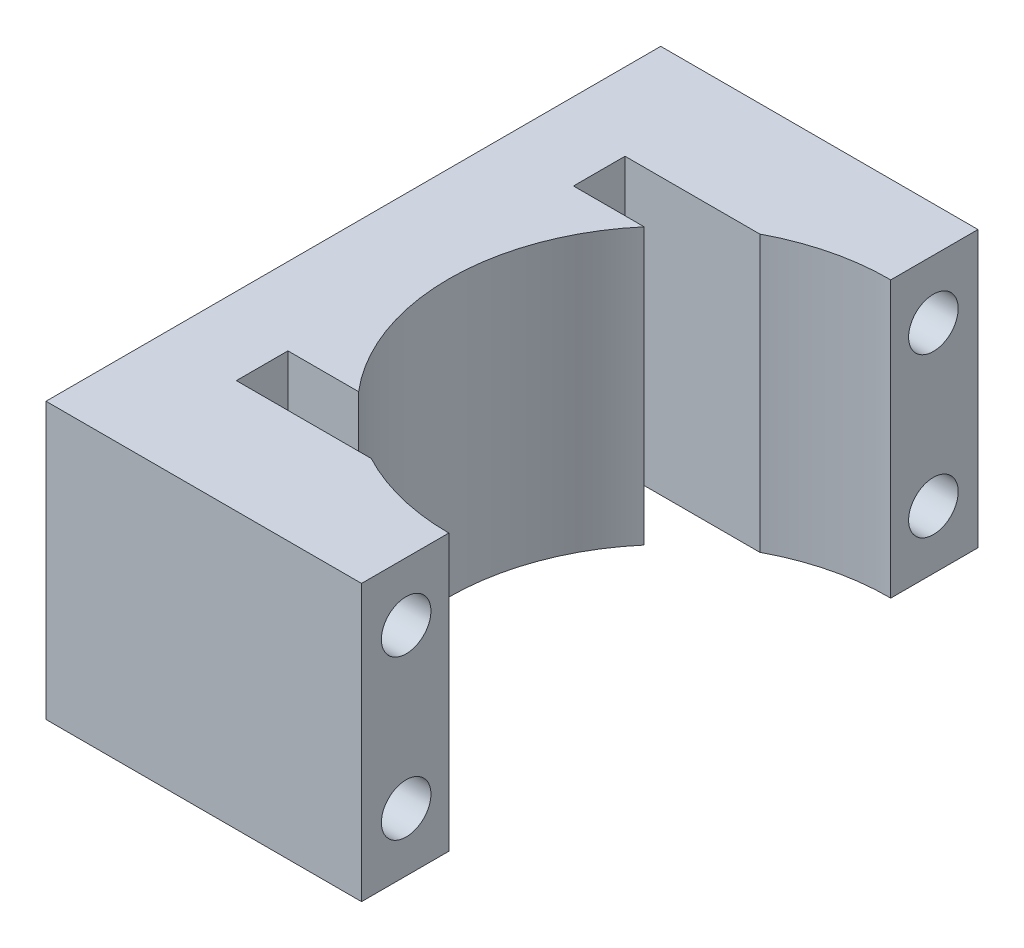
ISO-10303-21;
HEADER;
FILE_DESCRIPTION(('STEP AP214'),'2;1');
FILE_NAME('part.step','',(''),(''),'','','');
FILE_SCHEMA(('AUTOMOTIVE_DESIGN { 1 0 10303 214 1 1 1 1 }'));
ENDSEC;
DATA;
#1=APPLICATION_CONTEXT('core data for automotive mechanical design processes');
#2=APPLICATION_PROTOCOL_DEFINITION('international standard','automotive_design',2000,#1);
#3=PRODUCT_CONTEXT('',#1,'mechanical');
#4=PRODUCT('Part','Part','',(#3));
#5=PRODUCT_RELATED_PRODUCT_CATEGORY('part','',(#4));
#6=PRODUCT_DEFINITION_FORMATION('','',#4);
#7=PRODUCT_DEFINITION_CONTEXT('part definition',#1,'design');
#8=PRODUCT_DEFINITION('design','',#6,#7);
#9=PRODUCT_DEFINITION_SHAPE('','',#8);
#10=(LENGTH_UNIT() NAMED_UNIT(*) SI_UNIT(.MILLI.,.METRE.));
#11=(NAMED_UNIT(*) PLANE_ANGLE_UNIT() SI_UNIT($,.RADIAN.));
#12=(NAMED_UNIT(*) SI_UNIT($,.STERADIAN.) SOLID_ANGLE_UNIT());
#13=UNCERTAINTY_MEASURE_WITH_UNIT(LENGTH_MEASURE(1.E-05),#10,'distance_accuracy_value','');
#14=(GEOMETRIC_REPRESENTATION_CONTEXT(3) GLOBAL_UNCERTAINTY_ASSIGNED_CONTEXT((#13)) GLOBAL_UNIT_ASSIGNED_CONTEXT((#10,
#11,#12)) REPRESENTATION_CONTEXT('',''));
#15=CARTESIAN_POINT('',(0.,0.,0.));
#16=DIRECTION('',(0.,0.,1.));
#17=DIRECTION('',(1.,0.,0.));
#18=AXIS2_PLACEMENT_3D('',#15,#16,#17);
#19=CARTESIAN_POINT('',(0.,13.9,0.));
#20=DIRECTION('',(1.,0.,0.));
#21=DIRECTION('',(0.,0.,-1.));
#22=AXIS2_PLACEMENT_3D('',#19,#20,#21);
#23=PLANE('',#22);
#24=CARTESIAN_POINT('',(0.,2.95,-28.75));
#25=DIRECTION('',(-1.,0.,0.));
#26=DIRECTION('',(0.,0.,1.));
#27=AXIS2_PLACEMENT_3D('',#24,#25,#26);
#28=CIRCLE('',#27,1.25);
#29=CARTESIAN_POINT('',(0.,2.95,-27.5));
#30=VERTEX_POINT('',#29);
#31=EDGE_CURVE('E236',#30,#30,#28,.T.);
#32=ORIENTED_EDGE('',*,*,#31,.F.);
#33=EDGE_LOOP('',(#32));
#34=FACE_BOUND('',#33,.T.);
#35=CARTESIAN_POINT('',(0.,10.95,-2.25));
#36=DIRECTION('',(-1.,0.,0.));
#37=DIRECTION('',(0.,0.,1.));
#38=AXIS2_PLACEMENT_3D('',#35,#36,#37);
#39=CIRCLE('',#38,1.25);
#40=CARTESIAN_POINT('',(0.,10.95,-0.999999999999999));
#41=VERTEX_POINT('',#40);
#42=EDGE_CURVE('E239',#41,#41,#39,.T.);
#43=ORIENTED_EDGE('',*,*,#42,.F.);
#44=EDGE_LOOP('',(#43));
#45=FACE_BOUND('',#44,.T.);
#46=CARTESIAN_POINT('',(0.,2.95,-2.25));
#47=DIRECTION('',(-1.,0.,0.));
#48=DIRECTION('',(0.,0.,1.));
#49=AXIS2_PLACEMENT_3D('',#46,#47,#48);
#50=CIRCLE('',#49,1.25);
#51=CARTESIAN_POINT('',(0.,2.95,-0.999999999999998));
#52=VERTEX_POINT('',#51);
#53=EDGE_CURVE('E303',#52,#52,#50,.T.);
#54=ORIENTED_EDGE('',*,*,#53,.F.);
#55=EDGE_LOOP('',(#54));
#56=FACE_BOUND('',#55,.T.);
#57=CARTESIAN_POINT('',(0.,10.95,-28.75));
#58=DIRECTION('',(-1.,0.,0.));
#59=DIRECTION('',(0.,0.,1.));
#60=AXIS2_PLACEMENT_3D('',#57,#58,#59);
#61=CIRCLE('',#60,1.25);
#62=CARTESIAN_POINT('',(0.,10.95,-27.5));
#63=VERTEX_POINT('',#62);
#64=EDGE_CURVE('E231',#63,#63,#61,.T.);
#65=ORIENTED_EDGE('',*,*,#64,.F.);
#66=EDGE_LOOP('',(#65));
#67=FACE_BOUND('',#66,.T.);
#68=DIRECTION('',(0.,0.,1.));
#69=VECTOR('',#68,1.);
#70=CARTESIAN_POINT('',(0.,0.,0.));
#71=LINE('',#70,#69);
#72=CARTESIAN_POINT('',(0.,0.,-31.));
#73=VERTEX_POINT('',#72);
#74=CARTESIAN_POINT('',(0.,0.,0.));
#75=VERTEX_POINT('',#74);
#76=EDGE_CURVE('E169',#73,#75,#71,.T.);
#77=ORIENTED_EDGE('',*,*,#76,.T.);
#78=DIRECTION('',(0.,-1.,0.));
#79=VECTOR('',#78,1.);
#80=CARTESIAN_POINT('',(0.,13.9,0.));
#81=LINE('',#80,#79);
#82=CARTESIAN_POINT('',(0.,13.9,0.));
#83=VERTEX_POINT('',#82);
#84=EDGE_CURVE('E11',#83,#75,#81,.T.);
#85=ORIENTED_EDGE('',*,*,#84,.F.);
#86=DIRECTION('',(0.,0.,1.));
#87=VECTOR('',#86,1.);
#88=CARTESIAN_POINT('',(0.,13.9,0.));
#89=LINE('',#88,#87);
#90=CARTESIAN_POINT('',(0.,13.9,-31.));
#91=VERTEX_POINT('',#90);
#92=EDGE_CURVE('E195',#91,#83,#89,.T.);
#93=ORIENTED_EDGE('',*,*,#92,.F.);
#94=DIRECTION('',(0.,-1.,0.));
#95=VECTOR('',#94,1.);
#96=CARTESIAN_POINT('',(0.,13.9,-31.));
#97=LINE('',#96,#95);
#98=EDGE_CURVE('E165',#91,#73,#97,.T.);
#99=ORIENTED_EDGE('',*,*,#98,.T.);
#100=EDGE_LOOP('',(#77,#85,#93,#99));
#101=FACE_BOUND('',#100,.T.);
#102=ADVANCED_FACE('F35',(#34,#45,#56,#67,#101),#23,.F.);
#103=CARTESIAN_POINT('',(0.,13.9,0.));
#104=DIRECTION('',(0.,0.,-1.));
#105=DIRECTION('',(-1.,0.,0.));
#106=AXIS2_PLACEMENT_3D('',#103,#104,#105);
#107=PLANE('',#106);
#108=DIRECTION('',(1.,0.,0.));
#109=VECTOR('',#108,1.);
#110=CARTESIAN_POINT('',(0.,0.,0.));
#111=LINE('',#110,#109);
#112=CARTESIAN_POINT('',(15.9124850119688,0.,0.));
#113=VERTEX_POINT('',#112);
#114=EDGE_CURVE('E172',#75,#113,#111,.T.);
#115=ORIENTED_EDGE('',*,*,#114,.T.);
#116=DIRECTION('',(0.,-1.,0.));
#117=VECTOR('',#116,1.);
#118=CARTESIAN_POINT('',(15.9124850119688,13.9,0.));
#119=LINE('',#118,#117);
#120=CARTESIAN_POINT('',(15.9124850119688,13.9,0.));
#121=VERTEX_POINT('',#120);
#122=EDGE_CURVE('E44',#121,#113,#119,.T.);
#123=ORIENTED_EDGE('',*,*,#122,.F.);
#124=DIRECTION('',(1.,0.,0.));
#125=VECTOR('',#124,1.);
#126=CARTESIAN_POINT('',(0.,13.9,0.));
#127=LINE('',#126,#125);
#128=EDGE_CURVE('E114',#83,#121,#127,.T.);
#129=ORIENTED_EDGE('',*,*,#128,.F.);
#130=ORIENTED_EDGE('',*,*,#84,.T.);
#131=EDGE_LOOP('',(#115,#123,#129,#130));
#132=FACE_BOUND('',#131,.T.);
#133=ADVANCED_FACE('F288',(#132),#107,.F.);
#134=CARTESIAN_POINT('',(15.9124850119688,13.9,-4.4));
#135=DIRECTION('',(-1.,0.,0.));
#136=DIRECTION('',(0.,0.,1.));
#137=AXIS2_PLACEMENT_3D('',#134,#135,#136);
#138=PLANE('',#137);
#139=CARTESIAN_POINT('',(15.9124850119688,10.95,-2.25));
#140=DIRECTION('',(-1.,0.,0.));
#141=DIRECTION('',(0.,0.,1.));
#142=AXIS2_PLACEMENT_3D('',#139,#140,#141);
#143=CIRCLE('',#142,1.25);
#144=CARTESIAN_POINT('',(15.9124850119688,10.95,-0.999999999999999));
#145=VERTEX_POINT('',#144);
#146=EDGE_CURVE('E38',#145,#145,#143,.T.);
#147=ORIENTED_EDGE('',*,*,#146,.T.);
#148=EDGE_LOOP('',(#147));
#149=FACE_BOUND('',#148,.T.);
#150=CARTESIAN_POINT('',(15.9124850119688,2.95,-2.25));
#151=DIRECTION('',(-1.,0.,0.));
#152=DIRECTION('',(0.,0.,1.));
#153=AXIS2_PLACEMENT_3D('',#150,#151,#152);
#154=CIRCLE('',#153,1.25);
#155=CARTESIAN_POINT('',(15.9124850119688,2.95,-0.999999999999998));
#156=VERTEX_POINT('',#155);
#157=EDGE_CURVE('E224',#156,#156,#154,.T.);
#158=ORIENTED_EDGE('',*,*,#157,.T.);
#159=EDGE_LOOP('',(#158));
#160=FACE_BOUND('',#159,.T.);
#161=DIRECTION('',(0.,0.,-1.));
#162=VECTOR('',#161,1.);
#163=CARTESIAN_POINT('',(15.9124850119688,0.,-4.4));
#164=LINE('',#163,#162);
#165=CARTESIAN_POINT('',(15.9124850119688,0.,-4.4));
#166=VERTEX_POINT('',#165);
#167=EDGE_CURVE('E174',#113,#166,#164,.T.);
#168=ORIENTED_EDGE('',*,*,#167,.T.);
#169=DIRECTION('',(0.,-1.,0.));
#170=VECTOR('',#169,1.);
#171=CARTESIAN_POINT('',(15.9124850119688,13.9,-4.4));
#172=LINE('',#171,#170);
#173=CARTESIAN_POINT('',(15.9124850119688,13.9,-4.4));
#174=VERTEX_POINT('',#173);
#175=EDGE_CURVE('E220',#174,#166,#172,.T.);
#176=ORIENTED_EDGE('',*,*,#175,.F.);
#177=DIRECTION('',(0.,0.,-1.));
#178=VECTOR('',#177,1.);
#179=CARTESIAN_POINT('',(15.9124850119688,13.9,-4.4));
#180=LINE('',#179,#178);
#181=EDGE_CURVE('E244',#121,#174,#180,.T.);
#182=ORIENTED_EDGE('',*,*,#181,.F.);
#183=ORIENTED_EDGE('',*,*,#122,.T.);
#184=EDGE_LOOP('',(#168,#176,#182,#183));
#185=FACE_BOUND('',#184,.T.);
#186=ADVANCED_FACE('F293',(#149,#160,#185),#138,.F.);
#187=CARTESIAN_POINT('',(15.9124850119688,13.9,-15.5));
#188=DIRECTION('',(0.,-1.,0.));
#189=DIRECTION('',(0.,0.,-1.));
#190=AXIS2_PLACEMENT_3D('',#187,#188,#189);
#191=CYLINDRICAL_SURFACE('',#190,11.1);
#192=CARTESIAN_POINT('',(15.9124850119688,0.,-15.5));
#193=DIRECTION('',(0.,-1.,0.));
#194=DIRECTION('',(0.,0.,1.));
#195=AXIS2_PLACEMENT_3D('',#192,#193,#194);
#196=CIRCLE('',#195,11.1);
#197=CARTESIAN_POINT('',(10.7,0.,-5.69999999999999));
#198=VERTEX_POINT('',#197);
#199=EDGE_CURVE('E176',#166,#198,#196,.T.);
#200=ORIENTED_EDGE('',*,*,#199,.T.);
#201=DIRECTION('',(0.,-1.,0.));
#202=VECTOR('',#201,1.);
#203=CARTESIAN_POINT('',(10.7,13.9,-5.69999999999999));
#204=LINE('',#203,#202);
#205=CARTESIAN_POINT('',(10.7,13.9,-5.69999999999999));
#206=VERTEX_POINT('',#205);
#207=EDGE_CURVE('E217',#206,#198,#204,.T.);
#208=ORIENTED_EDGE('',*,*,#207,.F.);
#209=CARTESIAN_POINT('',(15.9124850119688,13.9,-15.5));
#210=DIRECTION('',(0.,-1.,0.));
#211=DIRECTION('',(0.,0.,1.));
#212=AXIS2_PLACEMENT_3D('',#209,#210,#211);
#213=CIRCLE('',#212,11.1);
#214=EDGE_CURVE('E246',#174,#206,#213,.T.);
#215=ORIENTED_EDGE('',*,*,#214,.F.);
#216=ORIENTED_EDGE('',*,*,#175,.T.);
#217=EDGE_LOOP('',(#200,#208,#215,#216));
#218=FACE_BOUND('',#217,.T.);
#219=ADVANCED_FACE('F338',(#218),#191,.F.);
#220=CARTESIAN_POINT('',(3.9,13.9,-5.7));
#221=DIRECTION('',(0.,0.,1.));
#222=DIRECTION('',(1.,0.,0.));
#223=AXIS2_PLACEMENT_3D('',#220,#221,#222);
#224=PLANE('',#223);
#225=DIRECTION('',(-1.,0.,0.));
#226=VECTOR('',#225,1.);
#227=CARTESIAN_POINT('',(3.9,0.,-5.7));
#228=LINE('',#227,#226);
#229=CARTESIAN_POINT('',(3.9,0.,-5.7));
#230=VERTEX_POINT('',#229);
#231=EDGE_CURVE('E178',#198,#230,#228,.T.);
#232=ORIENTED_EDGE('',*,*,#231,.T.);
#233=DIRECTION('',(0.,-1.,0.));
#234=VECTOR('',#233,1.);
#235=CARTESIAN_POINT('',(3.9,13.9,-5.7));
#236=LINE('',#235,#234);
#237=CARTESIAN_POINT('',(3.9,13.9,-5.7));
#238=VERTEX_POINT('',#237);
#239=EDGE_CURVE('E214',#238,#230,#236,.T.);
#240=ORIENTED_EDGE('',*,*,#239,.F.);
#241=DIRECTION('',(-1.,0.,0.));
#242=VECTOR('',#241,1.);
#243=CARTESIAN_POINT('',(3.9,13.9,-5.7));
#244=LINE('',#243,#242);
#245=EDGE_CURVE('E248',#206,#238,#244,.T.);
#246=ORIENTED_EDGE('',*,*,#245,.F.);
#247=ORIENTED_EDGE('',*,*,#207,.T.);
#248=EDGE_LOOP('',(#232,#240,#246,#247));
#249=FACE_BOUND('',#248,.T.);
#250=ADVANCED_FACE('F352',(#249),#224,.F.);
#251=CARTESIAN_POINT('',(3.9,13.9,-5.7));
#252=DIRECTION('',(-1.,0.,0.));
#253=DIRECTION('',(0.,0.,1.));
#254=AXIS2_PLACEMENT_3D('',#251,#252,#253);
#255=PLANE('',#254);
#256=DIRECTION('',(0.,0.,-1.));
#257=VECTOR('',#256,1.);
#258=CARTESIAN_POINT('',(3.9,0.,-5.7));
#259=LINE('',#258,#257);
#260=CARTESIAN_POINT('',(3.9,0.,-8.3));
#261=VERTEX_POINT('',#260);
#262=EDGE_CURVE('E180',#230,#261,#259,.T.);
#263=ORIENTED_EDGE('',*,*,#262,.T.);
#264=DIRECTION('',(0.,-1.,0.));
#265=VECTOR('',#264,1.);
#266=CARTESIAN_POINT('',(3.9,13.9,-8.3));
#267=LINE('',#266,#265);
#268=CARTESIAN_POINT('',(3.9,13.9,-8.3));
#269=VERTEX_POINT('',#268);
#270=EDGE_CURVE('E211',#269,#261,#267,.T.);
#271=ORIENTED_EDGE('',*,*,#270,.F.);
#272=DIRECTION('',(0.,0.,-1.));
#273=VECTOR('',#272,1.);
#274=CARTESIAN_POINT('',(3.9,13.9,-5.7));
#275=LINE('',#274,#273);
#276=EDGE_CURVE('E250',#238,#269,#275,.T.);
#277=ORIENTED_EDGE('',*,*,#276,.F.);
#278=ORIENTED_EDGE('',*,*,#239,.T.);
#279=EDGE_LOOP('',(#263,#271,#277,#278));
#280=FACE_BOUND('',#279,.T.);
#281=ADVANCED_FACE('F356',(#280),#255,.F.);
#282=CARTESIAN_POINT('',(3.9,13.9,-8.3));
#283=DIRECTION('',(0.,0.,-1.));
#284=DIRECTION('',(-1.,0.,0.));
#285=AXIS2_PLACEMENT_3D('',#282,#283,#284);
#286=PLANE('',#285);
#287=DIRECTION('',(1.,0.,0.));
#288=VECTOR('',#287,1.);
#289=CARTESIAN_POINT('',(3.9,0.,-8.3));
#290=LINE('',#289,#288);
#291=CARTESIAN_POINT('',(7.46440830777162,0.,-8.3));
#292=VERTEX_POINT('',#291);
#293=EDGE_CURVE('E182',#261,#292,#290,.T.);
#294=ORIENTED_EDGE('',*,*,#293,.T.);
#295=DIRECTION('',(0.,-1.,0.));
#296=VECTOR('',#295,1.);
#297=CARTESIAN_POINT('',(7.46440830777162,13.9,-8.3));
#298=LINE('',#297,#296);
#299=CARTESIAN_POINT('',(7.46440830777162,13.9,-8.3));
#300=VERTEX_POINT('',#299);
#301=EDGE_CURVE('E208',#300,#292,#298,.T.);
#302=ORIENTED_EDGE('',*,*,#301,.F.);
#303=DIRECTION('',(1.,0.,0.));
#304=VECTOR('',#303,1.);
#305=CARTESIAN_POINT('',(3.9,13.9,-8.3));
#306=LINE('',#305,#304);
#307=EDGE_CURVE('E252',#269,#300,#306,.T.);
#308=ORIENTED_EDGE('',*,*,#307,.F.);
#309=ORIENTED_EDGE('',*,*,#270,.T.);
#310=EDGE_LOOP('',(#294,#302,#308,#309));
#311=FACE_BOUND('',#310,.T.);
#312=ADVANCED_FACE('F363',(#311),#286,.F.);
#313=CARTESIAN_POINT('',(15.9124850119688,13.9,-15.5));
#314=DIRECTION('',(0.,-1.,0.));
#315=DIRECTION('',(0.,0.,-1.));
#316=AXIS2_PLACEMENT_3D('',#313,#314,#315);
#317=CYLINDRICAL_SURFACE('',#316,11.1);
#318=CARTESIAN_POINT('',(15.9124850119688,0.,-15.5));
#319=DIRECTION('',(0.,-1.,0.));
#320=DIRECTION('',(0.,0.,1.));
#321=AXIS2_PLACEMENT_3D('',#318,#319,#320);
#322=CIRCLE('',#321,11.1);
#323=CARTESIAN_POINT('',(7.46440830777162,0.,-22.7));
#324=VERTEX_POINT('',#323);
#325=EDGE_CURVE('E184',#292,#324,#322,.T.);
#326=ORIENTED_EDGE('',*,*,#325,.T.);
#327=DIRECTION('',(0.,-1.,0.));
#328=VECTOR('',#327,1.);
#329=CARTESIAN_POINT('',(7.46440830777162,13.9,-22.7));
#330=LINE('',#329,#328);
#331=CARTESIAN_POINT('',(7.46440830777162,13.9,-22.7));
#332=VERTEX_POINT('',#331);
#333=EDGE_CURVE('E205',#332,#324,#330,.T.);
#334=ORIENTED_EDGE('',*,*,#333,.F.);
#335=CARTESIAN_POINT('',(15.9124850119688,13.9,-15.5));
#336=DIRECTION('',(0.,-1.,0.));
#337=DIRECTION('',(0.,0.,1.));
#338=AXIS2_PLACEMENT_3D('',#335,#336,#337);
#339=CIRCLE('',#338,11.1);
#340=EDGE_CURVE('E254',#300,#332,#339,.T.);
#341=ORIENTED_EDGE('',*,*,#340,.F.);
#342=ORIENTED_EDGE('',*,*,#301,.T.);
#343=EDGE_LOOP('',(#326,#334,#341,#342));
#344=FACE_BOUND('',#343,.T.);
#345=ADVANCED_FACE('F366',(#344),#317,.F.);
#346=CARTESIAN_POINT('',(3.9,13.9,-22.7));
#347=DIRECTION('',(0.,0.,1.));
#348=DIRECTION('',(1.,0.,0.));
#349=AXIS2_PLACEMENT_3D('',#346,#347,#348);
#350=PLANE('',#349);
#351=DIRECTION('',(-1.,0.,0.));
#352=VECTOR('',#351,1.);
#353=CARTESIAN_POINT('',(3.9,0.,-22.7));
#354=LINE('',#353,#352);
#355=CARTESIAN_POINT('',(3.9,0.,-22.7));
#356=VERTEX_POINT('',#355);
#357=EDGE_CURVE('E186',#324,#356,#354,.T.);
#358=ORIENTED_EDGE('',*,*,#357,.T.);
#359=DIRECTION('',(0.,-1.,0.));
#360=VECTOR('',#359,1.);
#361=CARTESIAN_POINT('',(3.9,13.9,-22.7));
#362=LINE('',#361,#360);
#363=CARTESIAN_POINT('',(3.9,13.9,-22.7));
#364=VERTEX_POINT('',#363);
#365=EDGE_CURVE('E202',#364,#356,#362,.T.);
#366=ORIENTED_EDGE('',*,*,#365,.F.);
#367=DIRECTION('',(-1.,0.,0.));
#368=VECTOR('',#367,1.);
#369=CARTESIAN_POINT('',(3.9,13.9,-22.7));
#370=LINE('',#369,#368);
#371=EDGE_CURVE('E256',#332,#364,#370,.T.);
#372=ORIENTED_EDGE('',*,*,#371,.F.);
#373=ORIENTED_EDGE('',*,*,#333,.T.);
#374=EDGE_LOOP('',(#358,#366,#372,#373));
#375=FACE_BOUND('',#374,.T.);
#376=ADVANCED_FACE('F369',(#375),#350,.F.);
#377=CARTESIAN_POINT('',(3.9,13.9,-22.7));
#378=DIRECTION('',(-1.,0.,0.));
#379=DIRECTION('',(0.,0.,1.));
#380=AXIS2_PLACEMENT_3D('',#377,#378,#379);
#381=PLANE('',#380);
#382=DIRECTION('',(0.,0.,-1.));
#383=VECTOR('',#382,1.);
#384=CARTESIAN_POINT('',(3.9,0.,-22.7));
#385=LINE('',#384,#383);
#386=CARTESIAN_POINT('',(3.9,0.,-25.3));
#387=VERTEX_POINT('',#386);
#388=EDGE_CURVE('E188',#356,#387,#385,.T.);
#389=ORIENTED_EDGE('',*,*,#388,.T.);
#390=DIRECTION('',(0.,-1.,0.));
#391=VECTOR('',#390,1.);
#392=CARTESIAN_POINT('',(3.9,13.9,-25.3));
#393=LINE('',#392,#391);
#394=CARTESIAN_POINT('',(3.9,13.9,-25.3));
#395=VERTEX_POINT('',#394);
#396=EDGE_CURVE('E199',#395,#387,#393,.T.);
#397=ORIENTED_EDGE('',*,*,#396,.F.);
#398=DIRECTION('',(0.,0.,-1.));
#399=VECTOR('',#398,1.);
#400=CARTESIAN_POINT('',(3.9,13.9,-22.7));
#401=LINE('',#400,#399);
#402=EDGE_CURVE('E258',#364,#395,#401,.T.);
#403=ORIENTED_EDGE('',*,*,#402,.F.);
#404=ORIENTED_EDGE('',*,*,#365,.T.);
#405=EDGE_LOOP('',(#389,#397,#403,#404));
#406=FACE_BOUND('',#405,.T.);
#407=ADVANCED_FACE('F264',(#406),#381,.F.);
#408=CARTESIAN_POINT('',(3.9,13.9,-25.3));
#409=DIRECTION('',(0.,0.,-1.));
#410=DIRECTION('',(-1.,0.,0.));
#411=AXIS2_PLACEMENT_3D('',#408,#409,#410);
#412=PLANE('',#411);
#413=DIRECTION('',(1.,0.,0.));
#414=VECTOR('',#413,1.);
#415=CARTESIAN_POINT('',(3.9,0.,-25.3));
#416=LINE('',#415,#414);
#417=CARTESIAN_POINT('',(10.7,0.,-25.3));
#418=VERTEX_POINT('',#417);
#419=EDGE_CURVE('E190',#387,#418,#416,.T.);
#420=ORIENTED_EDGE('',*,*,#419,.T.);
#421=DIRECTION('',(0.,-1.,0.));
#422=VECTOR('',#421,1.);
#423=CARTESIAN_POINT('',(10.7,13.9,-25.3));
#424=LINE('',#423,#422);
#425=CARTESIAN_POINT('',(10.7,13.9,-25.3));
#426=VERTEX_POINT('',#425);
#427=EDGE_CURVE('E160',#426,#418,#424,.T.);
#428=ORIENTED_EDGE('',*,*,#427,.F.);
#429=DIRECTION('',(1.,0.,0.));
#430=VECTOR('',#429,1.);
#431=CARTESIAN_POINT('',(3.9,13.9,-25.3));
#432=LINE('',#431,#430);
#433=EDGE_CURVE('E151',#395,#426,#432,.T.);
#434=ORIENTED_EDGE('',*,*,#433,.F.);
#435=ORIENTED_EDGE('',*,*,#396,.T.);
#436=EDGE_LOOP('',(#420,#428,#434,#435));
#437=FACE_BOUND('',#436,.T.);
#438=ADVANCED_FACE('F268',(#437),#412,.F.);
#439=CARTESIAN_POINT('',(15.9124850119688,13.9,-15.5));
#440=DIRECTION('',(0.,-1.,0.));
#441=DIRECTION('',(0.,0.,-1.));
#442=AXIS2_PLACEMENT_3D('',#439,#440,#441);
#443=CYLINDRICAL_SURFACE('',#442,11.1);
#444=CARTESIAN_POINT('',(15.9124850119688,0.,-15.5));
#445=DIRECTION('',(0.,-1.,0.));
#446=DIRECTION('',(0.,0.,1.));
#447=AXIS2_PLACEMENT_3D('',#444,#445,#446);
#448=CIRCLE('',#447,11.1);
#449=CARTESIAN_POINT('',(16.,0.,-26.5996550003534));
#450=VERTEX_POINT('',#449);
#451=EDGE_CURVE('E159',#418,#450,#448,.T.);
#452=ORIENTED_EDGE('',*,*,#451,.T.);
#453=DIRECTION('',(0.,-1.,0.));
#454=VECTOR('',#453,1.);
#455=CARTESIAN_POINT('',(16.,13.9,-26.5996550003534));
#456=LINE('',#455,#454);
#457=CARTESIAN_POINT('',(16.,13.9,-26.5996550003534));
#458=VERTEX_POINT('',#457);
#459=EDGE_CURVE('E156',#458,#450,#456,.T.);
#460=ORIENTED_EDGE('',*,*,#459,.F.);
#461=CARTESIAN_POINT('',(15.9124850119688,13.9,-15.5));
#462=DIRECTION('',(0.,-1.,0.));
#463=DIRECTION('',(0.,0.,1.));
#464=AXIS2_PLACEMENT_3D('',#461,#462,#463);
#465=CIRCLE('',#464,11.1);
#466=EDGE_CURVE('E145',#426,#458,#465,.T.);
#467=ORIENTED_EDGE('',*,*,#466,.F.);
#468=ORIENTED_EDGE('',*,*,#427,.T.);
#469=EDGE_LOOP('',(#452,#460,#467,#468));
#470=FACE_BOUND('',#469,.T.);
#471=ADVANCED_FACE('F157',(#470),#443,.F.);
#472=CARTESIAN_POINT('',(16.,13.9,-26.5996550003534));
#473=DIRECTION('',(-1.,0.,0.));
#474=DIRECTION('',(0.,0.,1.));
#475=AXIS2_PLACEMENT_3D('',#472,#473,#474);
#476=PLANE('',#475);
#477=CARTESIAN_POINT('',(16.,2.95,-28.75));
#478=DIRECTION('',(-1.,0.,0.));
#479=DIRECTION('',(0.,0.,1.));
#480=AXIS2_PLACEMENT_3D('',#477,#478,#479);
#481=CIRCLE('',#480,1.25);
#482=CARTESIAN_POINT('',(16.,2.95,-27.5));
#483=VERTEX_POINT('',#482);
#484=EDGE_CURVE('E329',#483,#483,#481,.T.);
#485=ORIENTED_EDGE('',*,*,#484,.T.);
#486=EDGE_LOOP('',(#485));
#487=FACE_BOUND('',#486,.T.);
#488=CARTESIAN_POINT('',(16.,10.95,-28.75));
#489=DIRECTION('',(-1.,0.,0.));
#490=DIRECTION('',(0.,0.,1.));
#491=AXIS2_PLACEMENT_3D('',#488,#489,#490);
#492=CIRCLE('',#491,1.25);
#493=CARTESIAN_POINT('',(16.,10.95,-27.5));
#494=VERTEX_POINT('',#493);
#495=EDGE_CURVE('E226',#494,#494,#492,.T.);
#496=ORIENTED_EDGE('',*,*,#495,.T.);
#497=EDGE_LOOP('',(#496));
#498=FACE_BOUND('',#497,.T.);
#499=DIRECTION('',(0.,0.,-1.));
#500=VECTOR('',#499,1.);
#501=CARTESIAN_POINT('',(16.,0.,-26.5996550003534));
#502=LINE('',#501,#500);
#503=CARTESIAN_POINT('',(16.,0.,-31.));
#504=VERTEX_POINT('',#503);
#505=EDGE_CURVE('E100',#450,#504,#502,.T.);
#506=ORIENTED_EDGE('',*,*,#505,.T.);
#507=DIRECTION('',(0.,-1.,0.));
#508=VECTOR('',#507,1.);
#509=CARTESIAN_POINT('',(16.,13.9,-31.));
#510=LINE('',#509,#508);
#511=CARTESIAN_POINT('',(16.,13.9,-31.));
#512=VERTEX_POINT('',#511);
#513=EDGE_CURVE('E161',#512,#504,#510,.T.);
#514=ORIENTED_EDGE('',*,*,#513,.F.);
#515=DIRECTION('',(0.,0.,-1.));
#516=VECTOR('',#515,1.);
#517=CARTESIAN_POINT('',(16.,13.9,-26.5996550003534));
#518=LINE('',#517,#516);
#519=EDGE_CURVE('E149',#458,#512,#518,.T.);
#520=ORIENTED_EDGE('',*,*,#519,.F.);
#521=ORIENTED_EDGE('',*,*,#459,.T.);
#522=EDGE_LOOP('',(#506,#514,#520,#521));
#523=FACE_BOUND('',#522,.T.);
#524=ADVANCED_FACE('F163',(#487,#498,#523),#476,.F.);
#525=CARTESIAN_POINT('',(0.,13.9,-31.));
#526=DIRECTION('',(0.,0.,1.));
#527=DIRECTION('',(1.,0.,0.));
#528=AXIS2_PLACEMENT_3D('',#525,#526,#527);
#529=PLANE('',#528);
#530=DIRECTION('',(-1.,0.,0.));
#531=VECTOR('',#530,1.);
#532=CARTESIAN_POINT('',(0.,0.,-31.));
#533=LINE('',#532,#531);
#534=EDGE_CURVE('E106',#504,#73,#533,.T.);
#535=ORIENTED_EDGE('',*,*,#534,.T.);
#536=ORIENTED_EDGE('',*,*,#98,.F.);
#537=DIRECTION('',(-1.,0.,0.));
#538=VECTOR('',#537,1.);
#539=CARTESIAN_POINT('',(0.,13.9,-31.));
#540=LINE('',#539,#538);
#541=EDGE_CURVE('E53',#512,#91,#540,.T.);
#542=ORIENTED_EDGE('',*,*,#541,.F.);
#543=ORIENTED_EDGE('',*,*,#513,.T.);
#544=EDGE_LOOP('',(#535,#536,#542,#543));
#545=FACE_BOUND('',#544,.T.);
#546=ADVANCED_FACE('F276',(#545),#529,.F.);
#547=CARTESIAN_POINT('',(15.9124850119688,13.9,-15.5));
#548=DIRECTION('',(0.,1.,0.));
#549=DIRECTION('',(0.,0.,1.));
#550=AXIS2_PLACEMENT_3D('',#547,#548,#549);
#551=PLANE('',#550);
#552=ORIENTED_EDGE('',*,*,#92,.T.);
#553=ORIENTED_EDGE('',*,*,#128,.T.);
#554=ORIENTED_EDGE('',*,*,#181,.T.);
#555=ORIENTED_EDGE('',*,*,#214,.T.);
#556=ORIENTED_EDGE('',*,*,#245,.T.);
#557=ORIENTED_EDGE('',*,*,#276,.T.);
#558=ORIENTED_EDGE('',*,*,#307,.T.);
#559=ORIENTED_EDGE('',*,*,#340,.T.);
#560=ORIENTED_EDGE('',*,*,#371,.T.);
#561=ORIENTED_EDGE('',*,*,#402,.T.);
#562=ORIENTED_EDGE('',*,*,#433,.T.);
#563=ORIENTED_EDGE('',*,*,#466,.T.);
#564=ORIENTED_EDGE('',*,*,#519,.T.);
#565=ORIENTED_EDGE('',*,*,#541,.T.);
#566=EDGE_LOOP('',(#552,#553,#554,#555,#556,#557,#558,#559,#560,#561,#562,#563,#564,#565));
#567=FACE_BOUND('',#566,.T.);
#568=ADVANCED_FACE('F147',(#567),#551,.T.);
#569=CARTESIAN_POINT('',(15.9124850119688,0.,-15.5));
#570=DIRECTION('',(0.,1.,0.));
#571=DIRECTION('',(0.,0.,1.));
#572=AXIS2_PLACEMENT_3D('',#569,#570,#571);
#573=PLANE('',#572);
#574=ORIENTED_EDGE('',*,*,#76,.F.);
#575=ORIENTED_EDGE('',*,*,#534,.F.);
#576=ORIENTED_EDGE('',*,*,#505,.F.);
#577=ORIENTED_EDGE('',*,*,#451,.F.);
#578=ORIENTED_EDGE('',*,*,#419,.F.);
#579=ORIENTED_EDGE('',*,*,#388,.F.);
#580=ORIENTED_EDGE('',*,*,#357,.F.);
#581=ORIENTED_EDGE('',*,*,#325,.F.);
#582=ORIENTED_EDGE('',*,*,#293,.F.);
#583=ORIENTED_EDGE('',*,*,#262,.F.);
#584=ORIENTED_EDGE('',*,*,#231,.F.);
#585=ORIENTED_EDGE('',*,*,#199,.F.);
#586=ORIENTED_EDGE('',*,*,#167,.F.);
#587=ORIENTED_EDGE('',*,*,#114,.F.);
#588=EDGE_LOOP('',(#574,#575,#576,#577,#578,#579,#580,#581,#582,#583,#584,#585,#586,#587));
#589=FACE_BOUND('',#588,.T.);
#590=ADVANCED_FACE('F271',(#589),#573,.F.);
#591=CARTESIAN_POINT('',(16.,10.95,-28.75));
#592=DIRECTION('',(-1.,0.,0.));
#593=DIRECTION('',(0.,0.,1.));
#594=AXIS2_PLACEMENT_3D('',#591,#592,#593);
#595=CYLINDRICAL_SURFACE('',#594,1.25);
#596=ORIENTED_EDGE('',*,*,#495,.F.);
#597=EDGE_LOOP('',(#596));
#598=FACE_BOUND('',#597,.T.);
#599=ORIENTED_EDGE('',*,*,#64,.T.);
#600=EDGE_LOOP('',(#599));
#601=FACE_BOUND('',#600,.T.);
#602=ADVANCED_FACE('F306',(#598,#601),#595,.F.);
#603=CARTESIAN_POINT('',(16.,2.95,-28.75));
#604=DIRECTION('',(-1.,0.,0.));
#605=DIRECTION('',(0.,0.,1.));
#606=AXIS2_PLACEMENT_3D('',#603,#604,#605);
#607=CYLINDRICAL_SURFACE('',#606,1.25);
#608=ORIENTED_EDGE('',*,*,#484,.F.);
#609=EDGE_LOOP('',(#608));
#610=FACE_BOUND('',#609,.T.);
#611=ORIENTED_EDGE('',*,*,#31,.T.);
#612=EDGE_LOOP('',(#611));
#613=FACE_BOUND('',#612,.T.);
#614=ADVANCED_FACE('F308',(#610,#613),#607,.F.);
#615=CARTESIAN_POINT('',(16.,2.95,-2.25));
#616=DIRECTION('',(-1.,0.,0.));
#617=DIRECTION('',(0.,0.,1.));
#618=AXIS2_PLACEMENT_3D('',#615,#616,#617);
#619=CYLINDRICAL_SURFACE('',#618,1.25);
#620=ORIENTED_EDGE('',*,*,#53,.T.);
#621=EDGE_LOOP('',(#620));
#622=FACE_BOUND('',#621,.T.);
#623=ORIENTED_EDGE('',*,*,#157,.F.);
#624=EDGE_LOOP('',(#623));
#625=FACE_BOUND('',#624,.T.);
#626=ADVANCED_FACE('F315',(#622,#625),#619,.F.);
#627=CARTESIAN_POINT('',(16.,10.95,-2.25));
#628=DIRECTION('',(-1.,0.,0.));
#629=DIRECTION('',(0.,0.,1.));
#630=AXIS2_PLACEMENT_3D('',#627,#628,#629);
#631=CYLINDRICAL_SURFACE('',#630,1.25);
#632=ORIENTED_EDGE('',*,*,#42,.T.);
#633=EDGE_LOOP('',(#632));
#634=FACE_BOUND('',#633,.T.);
#635=ORIENTED_EDGE('',*,*,#146,.F.);
#636=EDGE_LOOP('',(#635));
#637=FACE_BOUND('',#636,.T.);
#638=ADVANCED_FACE('F319',(#634,#637),#631,.F.);
#639=CLOSED_SHELL('',(#102,#133,#186,#219,#250,#281,#312,#345,#376,#407,#438,#471,#524,#546,
#568,#590,#602,#614,#626,#638));
#640=MANIFOLD_SOLID_BREP('B2',#639);
#641=ADVANCED_BREP_SHAPE_REPRESENTATION('',(#18,#640),#14);
#642=SHAPE_DEFINITION_REPRESENTATION(#9,#641);
ENDSEC;
END-ISO-10303-21;
